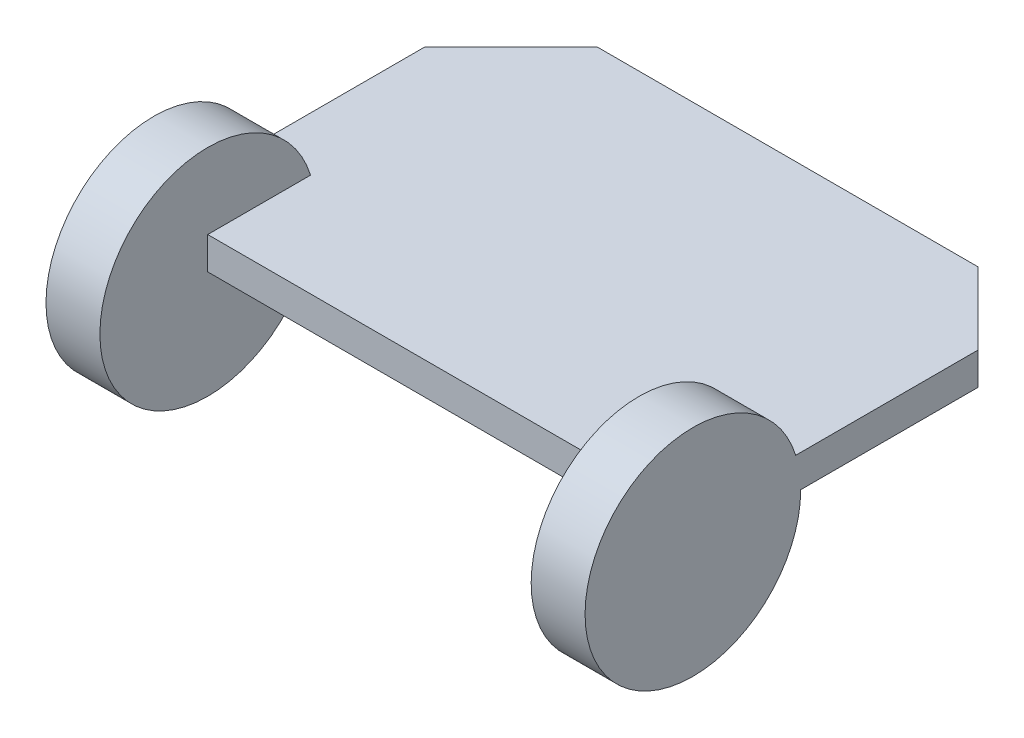
ISO-10303-21;
HEADER;
FILE_DESCRIPTION(('STEP AP214'),'2;1');
FILE_NAME('part.step','',(''),(''),'','','');
FILE_SCHEMA(('AUTOMOTIVE_DESIGN { 1 0 10303 214 1 1 1 1 }'));
ENDSEC;
DATA;
#1=APPLICATION_CONTEXT('core data for automotive mechanical design processes');
#2=APPLICATION_PROTOCOL_DEFINITION('international standard','automotive_design',2000,#1);
#3=PRODUCT_CONTEXT('',#1,'mechanical');
#4=PRODUCT('Part','Part','',(#3));
#5=PRODUCT_RELATED_PRODUCT_CATEGORY('part','',(#4));
#6=PRODUCT_DEFINITION_FORMATION('','',#4);
#7=PRODUCT_DEFINITION_CONTEXT('part definition',#1,'design');
#8=PRODUCT_DEFINITION('design','',#6,#7);
#9=PRODUCT_DEFINITION_SHAPE('','',#8);
#10=(LENGTH_UNIT() NAMED_UNIT(*) SI_UNIT(.MILLI.,.METRE.));
#11=(NAMED_UNIT(*) PLANE_ANGLE_UNIT() SI_UNIT($,.RADIAN.));
#12=(NAMED_UNIT(*) SI_UNIT($,.STERADIAN.) SOLID_ANGLE_UNIT());
#13=UNCERTAINTY_MEASURE_WITH_UNIT(LENGTH_MEASURE(1.E-05),#10,'distance_accuracy_value','');
#14=(GEOMETRIC_REPRESENTATION_CONTEXT(3) GLOBAL_UNCERTAINTY_ASSIGNED_CONTEXT((#13)) GLOBAL_UNIT_ASSIGNED_CONTEXT((#10,
#11,#12)) REPRESENTATION_CONTEXT('',''));
#15=CARTESIAN_POINT('',(0.,0.,0.));
#16=DIRECTION('',(0.,0.,1.));
#17=DIRECTION('',(1.,0.,0.));
#18=AXIS2_PLACEMENT_3D('',#15,#16,#17);
#19=CARTESIAN_POINT('',(0.,3.,0.));
#20=DIRECTION('',(0.,0.,-1.));
#21=DIRECTION('',(-1.,0.,0.));
#22=AXIS2_PLACEMENT_3D('',#19,#20,#21);
#23=PLANE('',#22);
#24=DIRECTION('',(0.,-1.,0.));
#25=VECTOR('',#24,1.);
#26=CARTESIAN_POINT('',(45.,3.,0.));
#27=LINE('',#26,#25);
#28=CARTESIAN_POINT('',(45.,3.,0.));
#29=VERTEX_POINT('',#28);
#30=CARTESIAN_POINT('',(45.,0.,0.));
#31=VERTEX_POINT('',#30);
#32=EDGE_CURVE('E178',#29,#31,#27,.T.);
#33=ORIENTED_EDGE('',*,*,#32,.F.);
#34=DIRECTION('',(1.,0.,0.));
#35=VECTOR('',#34,1.);
#36=CARTESIAN_POINT('',(0.,3.,0.));
#37=LINE('',#36,#35);
#38=CARTESIAN_POINT('',(5.,3.,0.));
#39=VERTEX_POINT('',#38);
#40=EDGE_CURVE('E131',#39,#29,#37,.T.);
#41=ORIENTED_EDGE('',*,*,#40,.F.);
#42=DIRECTION('',(0.,1.,0.));
#43=VECTOR('',#42,1.);
#44=CARTESIAN_POINT('',(5.,3.,0.));
#45=LINE('',#44,#43);
#46=CARTESIAN_POINT('',(5.,0.,0.));
#47=VERTEX_POINT('',#46);
#48=EDGE_CURVE('E207',#47,#39,#45,.T.);
#49=ORIENTED_EDGE('',*,*,#48,.F.);
#50=DIRECTION('',(1.,0.,0.));
#51=VECTOR('',#50,1.);
#52=CARTESIAN_POINT('',(0.,0.,0.));
#53=LINE('',#52,#51);
#54=EDGE_CURVE('E147',#47,#31,#53,.T.);
#55=ORIENTED_EDGE('',*,*,#54,.T.);
#56=EDGE_LOOP('',(#33,#41,#49,#55));
#57=FACE_BOUND('',#56,.T.);
#58=ADVANCED_FACE('F35',(#57),#23,.F.);
#59=CARTESIAN_POINT('',(50.,3.,0.));
#60=DIRECTION('',(-1.,0.,0.));
#61=DIRECTION('',(0.,0.,1.));
#62=AXIS2_PLACEMENT_3D('',#59,#60,#61);
#63=PLANE('',#62);
#64=DIRECTION('',(0.,0.,-1.));
#65=VECTOR('',#64,1.);
#66=CARTESIAN_POINT('',(50.,3.,0.));
#67=LINE('',#66,#65);
#68=CARTESIAN_POINT('',(50.,3.,-9.53939201416946));
#69=VERTEX_POINT('',#68);
#70=CARTESIAN_POINT('',(50.,3.,-26.4446940985374));
#71=VERTEX_POINT('',#70);
#72=EDGE_CURVE('E120',#69,#71,#67,.T.);
#73=ORIENTED_EDGE('',*,*,#72,.F.);
#74=CARTESIAN_POINT('',(50.,0.,0.));
#75=DIRECTION('',(1.,0.,0.));
#76=DIRECTION('',(0.,0.,-1.));
#77=AXIS2_PLACEMENT_3D('',#74,#75,#76);
#78=CIRCLE('',#77,10.);
#79=CARTESIAN_POINT('',(50.,0.,-10.));
#80=VERTEX_POINT('',#79);
#81=EDGE_CURVE('E49',#69,#80,#78,.T.);
#82=ORIENTED_EDGE('',*,*,#81,.T.);
#83=DIRECTION('',(0.,0.,-1.));
#84=VECTOR('',#83,1.);
#85=CARTESIAN_POINT('',(50.,0.,0.));
#86=LINE('',#85,#84);
#87=CARTESIAN_POINT('',(50.,0.,-26.4446940985374));
#88=VERTEX_POINT('',#87);
#89=EDGE_CURVE('E150',#80,#88,#86,.T.);
#90=ORIENTED_EDGE('',*,*,#89,.T.);
#91=DIRECTION('',(0.,-1.,0.));
#92=VECTOR('',#91,1.);
#93=CARTESIAN_POINT('',(50.,3.,-26.4446940985374));
#94=LINE('',#93,#92);
#95=EDGE_CURVE('E128',#71,#88,#94,.T.);
#96=ORIENTED_EDGE('',*,*,#95,.F.);
#97=EDGE_LOOP('',(#73,#82,#90,#96));
#98=FACE_BOUND('',#97,.T.);
#99=ADVANCED_FACE('F126',(#98),#63,.F.);
#100=CARTESIAN_POINT('',(38.2223470492687,3.,-38.2223470492687));
#101=DIRECTION('',(0.707106781186547,0.,-0.707106781186547));
#102=DIRECTION('',(-0.707106781186548,0.,-0.707106781186548));
#103=AXIS2_PLACEMENT_3D('',#100,#101,#102);
#104=PLANE('',#103);
#105=DIRECTION('',(0.707106781186548,0.,0.707106781186548));
#106=VECTOR('',#105,1.);
#107=CARTESIAN_POINT('',(38.2223470492687,0.,-38.2223470492687));
#108=LINE('',#107,#106);
#109=CARTESIAN_POINT('',(43.3153914073864,0.,-33.129302691151));
#110=VERTEX_POINT('',#109);
#111=EDGE_CURVE('E152',#110,#88,#108,.T.);
#112=ORIENTED_EDGE('',*,*,#111,.F.);
#113=DIRECTION('',(0.,-1.,0.));
#114=VECTOR('',#113,1.);
#115=CARTESIAN_POINT('',(43.3153914073864,3.,-33.129302691151));
#116=LINE('',#115,#114);
#117=CARTESIAN_POINT('',(43.3153914073864,3.,-33.129302691151));
#118=VERTEX_POINT('',#117);
#119=EDGE_CURVE('E166',#118,#110,#116,.T.);
#120=ORIENTED_EDGE('',*,*,#119,.F.);
#121=DIRECTION('',(0.707106781186548,0.,0.707106781186548));
#122=VECTOR('',#121,1.);
#123=CARTESIAN_POINT('',(38.2223470492687,3.,-38.2223470492687));
#124=LINE('',#123,#122);
#125=EDGE_CURVE('E130',#118,#71,#124,.T.);
#126=ORIENTED_EDGE('',*,*,#125,.T.);
#127=ORIENTED_EDGE('',*,*,#95,.T.);
#128=EDGE_LOOP('',(#112,#120,#126,#127));
#129=FACE_BOUND('',#128,.T.);
#130=ADVANCED_FACE('F185',(#129),#104,.T.);
#131=CARTESIAN_POINT('',(0.,3.,-33.129302691151));
#132=DIRECTION('',(0.,0.,-1.));
#133=DIRECTION('',(-1.,0.,0.));
#134=AXIS2_PLACEMENT_3D('',#131,#132,#133);
#135=PLANE('',#134);
#136=DIRECTION('',(1.,0.,0.));
#137=VECTOR('',#136,1.);
#138=CARTESIAN_POINT('',(0.,0.,-33.129302691151));
#139=LINE('',#138,#137);
#140=CARTESIAN_POINT('',(7.99230490164063,0.,-33.129302691151));
#141=VERTEX_POINT('',#140);
#142=EDGE_CURVE('E155',#141,#110,#139,.T.);
#143=ORIENTED_EDGE('',*,*,#142,.F.);
#144=DIRECTION('',(0.,-1.,0.));
#145=VECTOR('',#144,1.);
#146=CARTESIAN_POINT('',(7.99230490164063,3.,-33.129302691151));
#147=LINE('',#146,#145);
#148=CARTESIAN_POINT('',(7.99230490164063,3.,-33.129302691151));
#149=VERTEX_POINT('',#148);
#150=EDGE_CURVE('E164',#149,#141,#147,.T.);
#151=ORIENTED_EDGE('',*,*,#150,.F.);
#152=DIRECTION('',(1.,0.,0.));
#153=VECTOR('',#152,1.);
#154=CARTESIAN_POINT('',(0.,3.,-33.129302691151));
#155=LINE('',#154,#153);
#156=EDGE_CURVE('E133',#149,#118,#155,.T.);
#157=ORIENTED_EDGE('',*,*,#156,.T.);
#158=ORIENTED_EDGE('',*,*,#119,.T.);
#159=EDGE_LOOP('',(#143,#151,#157,#158));
#160=FACE_BOUND('',#159,.T.);
#161=ADVANCED_FACE('F190',(#160),#135,.T.);
#162=CARTESIAN_POINT('',(-12.5684988947552,3.,-12.5684988947552));
#163=DIRECTION('',(-0.707106781186547,0.,-0.707106781186547));
#164=DIRECTION('',(-0.707106781186548,0.,0.707106781186548));
#165=AXIS2_PLACEMENT_3D('',#162,#163,#164);
#166=PLANE('',#165);
#167=DIRECTION('',(0.707106781186548,0.,-0.707106781186548));
#168=VECTOR('',#167,1.);
#169=CARTESIAN_POINT('',(-12.5684988947552,0.,-12.5684988947552));
#170=LINE('',#169,#168);
#171=CARTESIAN_POINT('',(0.,0.,-25.1369977895104));
#172=VERTEX_POINT('',#171);
#173=EDGE_CURVE('E158',#172,#141,#170,.T.);
#174=ORIENTED_EDGE('',*,*,#173,.F.);
#175=DIRECTION('',(0.,-1.,0.));
#176=VECTOR('',#175,1.);
#177=CARTESIAN_POINT('',(0.,3.,-25.1369977895104));
#178=LINE('',#177,#176);
#179=CARTESIAN_POINT('',(0.,3.,-25.1369977895104));
#180=VERTEX_POINT('',#179);
#181=EDGE_CURVE('E146',#180,#172,#178,.T.);
#182=ORIENTED_EDGE('',*,*,#181,.F.);
#183=DIRECTION('',(0.707106781186548,0.,-0.707106781186548));
#184=VECTOR('',#183,1.);
#185=CARTESIAN_POINT('',(-12.5684988947552,3.,-12.5684988947552));
#186=LINE('',#185,#184);
#187=EDGE_CURVE('E141',#180,#149,#186,.T.);
#188=ORIENTED_EDGE('',*,*,#187,.T.);
#189=ORIENTED_EDGE('',*,*,#150,.T.);
#190=EDGE_LOOP('',(#174,#182,#188,#189));
#191=FACE_BOUND('',#190,.T.);
#192=ADVANCED_FACE('F193',(#191),#166,.T.);
#193=CARTESIAN_POINT('',(0.,3.,0.));
#194=DIRECTION('',(-1.,0.,0.));
#195=DIRECTION('',(0.,0.,1.));
#196=AXIS2_PLACEMENT_3D('',#193,#194,#195);
#197=PLANE('',#196);
#198=DIRECTION('',(0.,0.,-1.));
#199=VECTOR('',#198,1.);
#200=CARTESIAN_POINT('',(0.,0.,0.));
#201=LINE('',#200,#199);
#202=CARTESIAN_POINT('',(0.,0.,-10.));
#203=VERTEX_POINT('',#202);
#204=EDGE_CURVE('E135',#203,#172,#201,.T.);
#205=ORIENTED_EDGE('',*,*,#204,.F.);
#206=CARTESIAN_POINT('',(0.,0.,0.));
#207=DIRECTION('',(-1.,0.,0.));
#208=DIRECTION('',(0.,0.,1.));
#209=AXIS2_PLACEMENT_3D('',#206,#207,#208);
#210=CIRCLE('',#209,10.);
#211=CARTESIAN_POINT('',(0.,3.,-9.53939201416946));
#212=VERTEX_POINT('',#211);
#213=EDGE_CURVE('E124',#203,#212,#210,.T.);
#214=ORIENTED_EDGE('',*,*,#213,.T.);
#215=DIRECTION('',(0.,0.,-1.));
#216=VECTOR('',#215,1.);
#217=CARTESIAN_POINT('',(0.,3.,0.));
#218=LINE('',#217,#216);
#219=EDGE_CURVE('E144',#212,#180,#218,.T.);
#220=ORIENTED_EDGE('',*,*,#219,.T.);
#221=ORIENTED_EDGE('',*,*,#181,.T.);
#222=EDGE_LOOP('',(#205,#214,#220,#221));
#223=FACE_BOUND('',#222,.T.);
#224=ADVANCED_FACE('F205',(#223),#197,.T.);
#225=CARTESIAN_POINT('',(0.,3.,0.));
#226=DIRECTION('',(0.,1.,0.));
#227=DIRECTION('',(0.,0.,1.));
#228=AXIS2_PLACEMENT_3D('',#225,#226,#227);
#229=PLANE('',#228);
#230=DIRECTION('',(1.,0.,0.));
#231=VECTOR('',#230,1.);
#232=CARTESIAN_POINT('',(45.,3.,-9.53939201416946));
#233=LINE('',#232,#231);
#234=CARTESIAN_POINT('',(45.,3.,-9.53939201416946));
#235=VERTEX_POINT('',#234);
#236=EDGE_CURVE('E112',#69,#235,#233,.F.);
#237=ORIENTED_EDGE('',*,*,#236,.F.);
#238=ORIENTED_EDGE('',*,*,#72,.T.);
#239=ORIENTED_EDGE('',*,*,#125,.F.);
#240=ORIENTED_EDGE('',*,*,#156,.F.);
#241=ORIENTED_EDGE('',*,*,#187,.F.);
#242=ORIENTED_EDGE('',*,*,#219,.F.);
#243=DIRECTION('',(-1.,0.,0.));
#244=VECTOR('',#243,1.);
#245=CARTESIAN_POINT('',(5.,3.,-9.53939201416946));
#246=LINE('',#245,#244);
#247=CARTESIAN_POINT('',(5.,3.,-9.53939201416946));
#248=VERTEX_POINT('',#247);
#249=EDGE_CURVE('E57',#248,#212,#246,.T.);
#250=ORIENTED_EDGE('',*,*,#249,.F.);
#251=DIRECTION('',(0.,0.,1.));
#252=VECTOR('',#251,1.);
#253=CARTESIAN_POINT('',(5.,3.,0.));
#254=LINE('',#253,#252);
#255=EDGE_CURVE('E204',#248,#39,#254,.T.);
#256=ORIENTED_EDGE('',*,*,#255,.T.);
#257=ORIENTED_EDGE('',*,*,#40,.T.);
#258=DIRECTION('',(0.,0.,-1.));
#259=VECTOR('',#258,1.);
#260=CARTESIAN_POINT('',(45.,3.,0.));
#261=LINE('',#260,#259);
#262=EDGE_CURVE('E123',#29,#235,#261,.T.);
#263=ORIENTED_EDGE('',*,*,#262,.T.);
#264=EDGE_LOOP('',(#237,#238,#239,#240,#241,#242,#250,#256,#257,#263));
#265=FACE_BOUND('',#264,.T.);
#266=ADVANCED_FACE('F118',(#265),#229,.T.);
#267=CARTESIAN_POINT('',(0.,0.,0.));
#268=DIRECTION('',(0.,1.,0.));
#269=DIRECTION('',(0.,0.,1.));
#270=AXIS2_PLACEMENT_3D('',#267,#268,#269);
#271=PLANE('',#270);
#272=ORIENTED_EDGE('',*,*,#89,.F.);
#273=DIRECTION('',(1.,0.,0.));
#274=VECTOR('',#273,1.);
#275=CARTESIAN_POINT('',(45.,0.,-10.));
#276=LINE('',#275,#274);
#277=CARTESIAN_POINT('',(45.,0.,-10.));
#278=VERTEX_POINT('',#277);
#279=EDGE_CURVE('E11',#80,#278,#276,.F.);
#280=ORIENTED_EDGE('',*,*,#279,.T.);
#281=DIRECTION('',(0.,0.,-1.));
#282=VECTOR('',#281,1.);
#283=CARTESIAN_POINT('',(45.,0.,0.));
#284=LINE('',#283,#282);
#285=EDGE_CURVE('E42',#31,#278,#284,.T.);
#286=ORIENTED_EDGE('',*,*,#285,.F.);
#287=ORIENTED_EDGE('',*,*,#54,.F.);
#288=DIRECTION('',(0.,0.,1.));
#289=VECTOR('',#288,1.);
#290=CARTESIAN_POINT('',(5.,0.,0.));
#291=LINE('',#290,#289);
#292=CARTESIAN_POINT('',(5.,0.,-10.));
#293=VERTEX_POINT('',#292);
#294=EDGE_CURVE('E169',#293,#47,#291,.T.);
#295=ORIENTED_EDGE('',*,*,#294,.F.);
#296=DIRECTION('',(-1.,0.,0.));
#297=VECTOR('',#296,1.);
#298=CARTESIAN_POINT('',(5.,0.,-10.));
#299=LINE('',#298,#297);
#300=EDGE_CURVE('E172',#293,#203,#299,.T.);
#301=ORIENTED_EDGE('',*,*,#300,.T.);
#302=ORIENTED_EDGE('',*,*,#204,.T.);
#303=ORIENTED_EDGE('',*,*,#173,.T.);
#304=ORIENTED_EDGE('',*,*,#142,.T.);
#305=ORIENTED_EDGE('',*,*,#111,.T.);
#306=EDGE_LOOP('',(#272,#280,#286,#287,#295,#301,#302,#303,#304,#305));
#307=FACE_BOUND('',#306,.T.);
#308=ADVANCED_FACE('F182',(#307),#271,.F.);
#309=CARTESIAN_POINT('',(5.,0.,0.));
#310=DIRECTION('',(-1.,0.,0.));
#311=DIRECTION('',(0.,0.,1.));
#312=AXIS2_PLACEMENT_3D('',#309,#310,#311);
#313=CYLINDRICAL_SURFACE('',#312,10.);
#314=CARTESIAN_POINT('',(5.,0.,0.));
#315=DIRECTION('',(-1.,0.,0.));
#316=DIRECTION('',(0.,0.,1.));
#317=AXIS2_PLACEMENT_3D('',#314,#315,#316);
#318=CIRCLE('',#317,10.);
#319=EDGE_CURVE('E203',#293,#248,#318,.T.);
#320=ORIENTED_EDGE('',*,*,#319,.T.);
#321=ORIENTED_EDGE('',*,*,#249,.T.);
#322=ORIENTED_EDGE('',*,*,#213,.F.);
#323=ORIENTED_EDGE('',*,*,#300,.F.);
#324=EDGE_LOOP('',(#320,#321,#322,#323));
#325=FACE_BOUND('',#324,.T.);
#326=ADVANCED_FACE('F200',(#325),#313,.T.);
#327=CARTESIAN_POINT('',(5.,0.,0.));
#328=DIRECTION('',(-1.,0.,0.));
#329=DIRECTION('',(0.,0.,1.));
#330=AXIS2_PLACEMENT_3D('',#327,#328,#329);
#331=PLANE('',#330);
#332=ORIENTED_EDGE('',*,*,#255,.F.);
#333=ORIENTED_EDGE('',*,*,#319,.F.);
#334=ORIENTED_EDGE('',*,*,#294,.T.);
#335=ORIENTED_EDGE('',*,*,#48,.T.);
#336=EDGE_LOOP('',(#332,#333,#334,#335));
#337=FACE_BOUND('',#336,.T.);
#338=ADVANCED_FACE('F215',(#337),#331,.F.);
#339=CARTESIAN_POINT('',(45.,0.,0.));
#340=DIRECTION('',(1.,0.,0.));
#341=DIRECTION('',(0.,0.,-1.));
#342=AXIS2_PLACEMENT_3D('',#339,#340,#341);
#343=CYLINDRICAL_SURFACE('',#342,10.);
#344=ORIENTED_EDGE('',*,*,#81,.F.);
#345=ORIENTED_EDGE('',*,*,#236,.T.);
#346=CARTESIAN_POINT('',(45.,0.,0.));
#347=DIRECTION('',(1.,0.,0.));
#348=DIRECTION('',(0.,0.,-1.));
#349=AXIS2_PLACEMENT_3D('',#346,#347,#348);
#350=CIRCLE('',#349,10.);
#351=EDGE_CURVE('E115',#235,#278,#350,.T.);
#352=ORIENTED_EDGE('',*,*,#351,.T.);
#353=ORIENTED_EDGE('',*,*,#279,.F.);
#354=EDGE_LOOP('',(#344,#345,#352,#353));
#355=FACE_BOUND('',#354,.T.);
#356=ADVANCED_FACE('F110',(#355),#343,.T.);
#357=CARTESIAN_POINT('',(45.,0.,0.));
#358=DIRECTION('',(1.,0.,0.));
#359=DIRECTION('',(0.,0.,-1.));
#360=AXIS2_PLACEMENT_3D('',#357,#358,#359);
#361=PLANE('',#360);
#362=ORIENTED_EDGE('',*,*,#262,.F.);
#363=ORIENTED_EDGE('',*,*,#32,.T.);
#364=ORIENTED_EDGE('',*,*,#285,.T.);
#365=ORIENTED_EDGE('',*,*,#351,.F.);
#366=EDGE_LOOP('',(#362,#363,#364,#365));
#367=FACE_BOUND('',#366,.T.);
#368=ADVANCED_FACE('F176',(#367),#361,.F.);
#369=CLOSED_SHELL('',(#58,#99,#130,#161,#192,#224,#266,#308,#326,#338,#356,#368));
#370=MANIFOLD_SOLID_BREP('B2',#369);
#371=ADVANCED_BREP_SHAPE_REPRESENTATION('',(#18,#370),#14);
#372=SHAPE_DEFINITION_REPRESENTATION(#9,#371);
ENDSEC;
END-ISO-10303-21;
